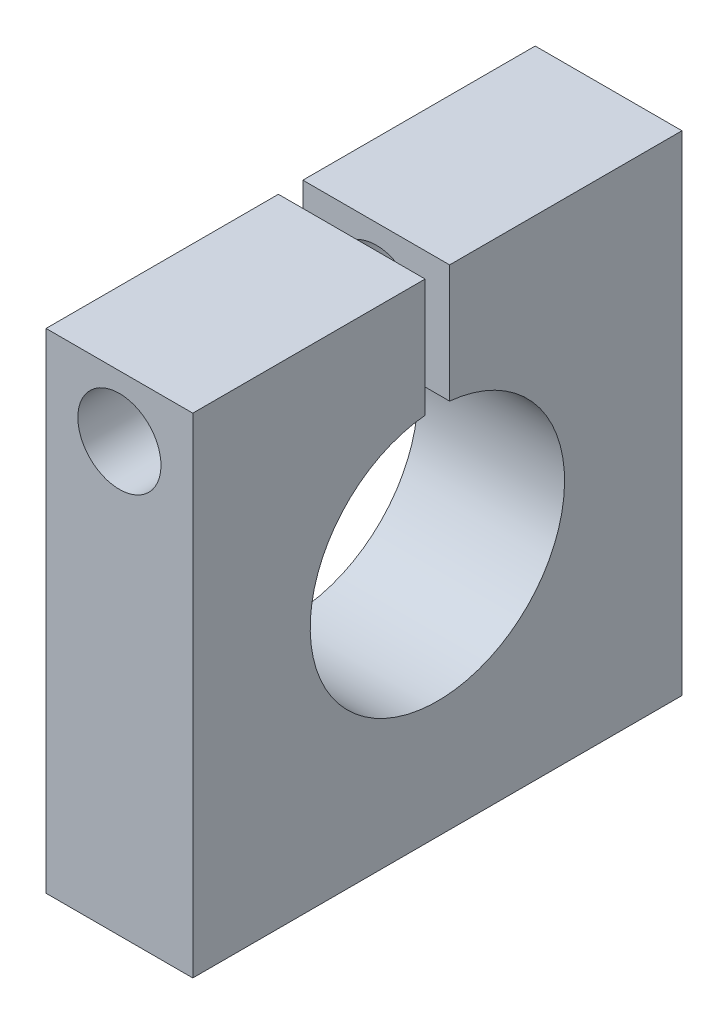
ISO-10303-21;
HEADER;
FILE_DESCRIPTION(('STEP AP214'),'2;1');
FILE_NAME('part.step','',(''),(''),'','','');
FILE_SCHEMA(('AUTOMOTIVE_DESIGN { 1 0 10303 214 1 1 1 1 }'));
ENDSEC;
DATA;
#1=APPLICATION_CONTEXT('core data for automotive mechanical design processes');
#2=APPLICATION_PROTOCOL_DEFINITION('international standard','automotive_design',2000,#1);
#3=PRODUCT_CONTEXT('',#1,'mechanical');
#4=PRODUCT('Part','Part','',(#3));
#5=PRODUCT_RELATED_PRODUCT_CATEGORY('part','',(#4));
#6=PRODUCT_DEFINITION_FORMATION('','',#4);
#7=PRODUCT_DEFINITION_CONTEXT('part definition',#1,'design');
#8=PRODUCT_DEFINITION('design','',#6,#7);
#9=PRODUCT_DEFINITION_SHAPE('','',#8);
#10=(LENGTH_UNIT() NAMED_UNIT(*) SI_UNIT(.MILLI.,.METRE.));
#11=(NAMED_UNIT(*) PLANE_ANGLE_UNIT() SI_UNIT($,.RADIAN.));
#12=(NAMED_UNIT(*) SI_UNIT($,.STERADIAN.) SOLID_ANGLE_UNIT());
#13=UNCERTAINTY_MEASURE_WITH_UNIT(LENGTH_MEASURE(1.E-05),#10,'distance_accuracy_value','');
#14=(GEOMETRIC_REPRESENTATION_CONTEXT(3) GLOBAL_UNCERTAINTY_ASSIGNED_CONTEXT((#13)) GLOBAL_UNIT_ASSIGNED_CONTEXT((#10,
#11,#12)) REPRESENTATION_CONTEXT('',''));
#15=CARTESIAN_POINT('',(0.,0.,0.));
#16=DIRECTION('',(0.,0.,1.));
#17=DIRECTION('',(1.,0.,0.));
#18=AXIS2_PLACEMENT_3D('',#15,#16,#17);
#19=CARTESIAN_POINT('',(6.,0.,0.));
#20=DIRECTION('',(-1.,0.,0.));
#21=DIRECTION('',(0.,0.,1.));
#22=AXIS2_PLACEMENT_3D('',#19,#20,#21);
#23=CYLINDRICAL_SURFACE('',#22,5.2);
#24=CARTESIAN_POINT('',(0.,0.,0.));
#25=DIRECTION('',(1.,0.,0.));
#26=DIRECTION('',(0.,0.,-1.));
#27=AXIS2_PLACEMENT_3D('',#24,#25,#26);
#28=CIRCLE('',#27,5.2);
#29=CARTESIAN_POINT('',(0.,5.17590571784301,0.499999999999998));
#30=VERTEX_POINT('',#29);
#31=CARTESIAN_POINT('',(0.,5.17590571784301,-0.500000000000003));
#32=VERTEX_POINT('',#31);
#33=EDGE_CURVE('E144',#30,#32,#28,.T.);
#34=ORIENTED_EDGE('',*,*,#33,.F.);
#35=DIRECTION('',(-1.,0.,0.));
#36=VECTOR('',#35,1.);
#37=CARTESIAN_POINT('',(6.,5.17590571784301,0.499999999999998));
#38=LINE('',#37,#36);
#39=CARTESIAN_POINT('',(6.,5.17590571784301,0.499999999999998));
#40=VERTEX_POINT('',#39);
#41=EDGE_CURVE('E11',#40,#30,#38,.T.);
#42=ORIENTED_EDGE('',*,*,#41,.F.);
#43=CARTESIAN_POINT('',(6.,0.,0.));
#44=DIRECTION('',(1.,0.,0.));
#45=DIRECTION('',(0.,0.,-1.));
#46=AXIS2_PLACEMENT_3D('',#43,#44,#45);
#47=CIRCLE('',#46,5.2);
#48=CARTESIAN_POINT('',(6.,5.17590571784301,-0.500000000000003));
#49=VERTEX_POINT('',#48);
#50=EDGE_CURVE('E135',#40,#49,#47,.T.);
#51=ORIENTED_EDGE('',*,*,#50,.T.);
#52=DIRECTION('',(-1.,0.,0.));
#53=VECTOR('',#52,1.);
#54=CARTESIAN_POINT('',(6.,5.17590571784301,-0.500000000000003));
#55=LINE('',#54,#53);
#56=EDGE_CURVE('E86',#49,#32,#55,.T.);
#57=ORIENTED_EDGE('',*,*,#56,.T.);
#58=EDGE_LOOP('',(#34,#42,#51,#57));
#59=FACE_BOUND('',#58,.T.);
#60=ADVANCED_FACE('F35',(#59),#23,.F.);
#61=CARTESIAN_POINT('',(6.,0.,0.499999999999998));
#62=DIRECTION('',(0.,0.,-1.));
#63=DIRECTION('',(0.,1.,0.));
#64=AXIS2_PLACEMENT_3D('',#61,#62,#63);
#65=PLANE('',#64);
#66=CARTESIAN_POINT('',(3.,7.5,0.499999999999999));
#67=DIRECTION('',(0.,0.,-1.));
#68=DIRECTION('',(0.,1.,0.));
#69=AXIS2_PLACEMENT_3D('',#66,#67,#68);
#70=CIRCLE('',#69,1.7);
#71=CARTESIAN_POINT('',(3.,9.2,0.499999999999999));
#72=VERTEX_POINT('',#71);
#73=EDGE_CURVE('E141',#72,#72,#70,.T.);
#74=ORIENTED_EDGE('',*,*,#73,.F.);
#75=EDGE_LOOP('',(#74));
#76=FACE_BOUND('',#75,.T.);
#77=DIRECTION('',(0.,-1.,0.));
#78=VECTOR('',#77,1.);
#79=CARTESIAN_POINT('',(0.,0.,0.499999999999998));
#80=LINE('',#79,#78);
#81=CARTESIAN_POINT('',(0.,10.,0.499999999999999));
#82=VERTEX_POINT('',#81);
#83=EDGE_CURVE('E180',#82,#30,#80,.T.);
#84=ORIENTED_EDGE('',*,*,#83,.F.);
#85=DIRECTION('',(-1.,0.,0.));
#86=VECTOR('',#85,1.);
#87=CARTESIAN_POINT('',(6.,10.,0.499999999999999));
#88=LINE('',#87,#86);
#89=CARTESIAN_POINT('',(6.,10.,0.499999999999999));
#90=VERTEX_POINT('',#89);
#91=EDGE_CURVE('E44',#90,#82,#88,.T.);
#92=ORIENTED_EDGE('',*,*,#91,.F.);
#93=DIRECTION('',(0.,-1.,0.));
#94=VECTOR('',#93,1.);
#95=CARTESIAN_POINT('',(6.,0.,0.499999999999998));
#96=LINE('',#95,#94);
#97=EDGE_CURVE('E131',#90,#40,#96,.T.);
#98=ORIENTED_EDGE('',*,*,#97,.T.);
#99=ORIENTED_EDGE('',*,*,#41,.T.);
#100=EDGE_LOOP('',(#84,#92,#98,#99));
#101=FACE_BOUND('',#100,.T.);
#102=ADVANCED_FACE('F172',(#76,#101),#65,.T.);
#103=CARTESIAN_POINT('',(6.,10.,0.));
#104=DIRECTION('',(0.,1.,0.));
#105=DIRECTION('',(0.,0.,1.));
#106=AXIS2_PLACEMENT_3D('',#103,#104,#105);
#107=PLANE('',#106);
#108=DIRECTION('',(0.,0.,-1.));
#109=VECTOR('',#108,1.);
#110=CARTESIAN_POINT('',(0.,10.,0.));
#111=LINE('',#110,#109);
#112=CARTESIAN_POINT('',(0.,10.,10.));
#113=VERTEX_POINT('',#112);
#114=EDGE_CURVE('E186',#113,#82,#111,.T.);
#115=ORIENTED_EDGE('',*,*,#114,.F.);
#116=DIRECTION('',(-1.,0.,0.));
#117=VECTOR('',#116,1.);
#118=CARTESIAN_POINT('',(6.,10.,10.));
#119=LINE('',#118,#117);
#120=CARTESIAN_POINT('',(6.,10.,10.));
#121=VERTEX_POINT('',#120);
#122=EDGE_CURVE('E204',#121,#113,#119,.T.);
#123=ORIENTED_EDGE('',*,*,#122,.F.);
#124=DIRECTION('',(0.,0.,-1.));
#125=VECTOR('',#124,1.);
#126=CARTESIAN_POINT('',(6.,10.,0.));
#127=LINE('',#126,#125);
#128=EDGE_CURVE('E125',#121,#90,#127,.T.);
#129=ORIENTED_EDGE('',*,*,#128,.T.);
#130=ORIENTED_EDGE('',*,*,#91,.T.);
#131=EDGE_LOOP('',(#115,#123,#129,#130));
#132=FACE_BOUND('',#131,.T.);
#133=ADVANCED_FACE('F176',(#132),#107,.T.);
#134=CARTESIAN_POINT('',(6.,0.,10.));
#135=DIRECTION('',(0.,0.,-1.));
#136=DIRECTION('',(-1.,0.,0.));
#137=AXIS2_PLACEMENT_3D('',#134,#135,#136);
#138=PLANE('',#137);
#139=CARTESIAN_POINT('',(3.,7.5,10.));
#140=DIRECTION('',(0.,0.,-1.));
#141=DIRECTION('',(0.,1.,0.));
#142=AXIS2_PLACEMENT_3D('',#139,#140,#141);
#143=CIRCLE('',#142,1.7);
#144=CARTESIAN_POINT('',(3.,9.2,10.));
#145=VERTEX_POINT('',#144);
#146=EDGE_CURVE('E148',#145,#145,#143,.T.);
#147=ORIENTED_EDGE('',*,*,#146,.T.);
#148=EDGE_LOOP('',(#147));
#149=FACE_BOUND('',#148,.T.);
#150=DIRECTION('',(0.,-1.,0.));
#151=VECTOR('',#150,1.);
#152=CARTESIAN_POINT('',(0.,0.,10.));
#153=LINE('',#152,#151);
#154=CARTESIAN_POINT('',(0.,-10.,10.));
#155=VERTEX_POINT('',#154);
#156=EDGE_CURVE('E188',#113,#155,#153,.T.);
#157=ORIENTED_EDGE('',*,*,#156,.T.);
#158=DIRECTION('',(-1.,0.,0.));
#159=VECTOR('',#158,1.);
#160=CARTESIAN_POINT('',(6.,-10.,10.));
#161=LINE('',#160,#159);
#162=CARTESIAN_POINT('',(6.,-10.,10.));
#163=VERTEX_POINT('',#162);
#164=EDGE_CURVE('E201',#163,#155,#161,.T.);
#165=ORIENTED_EDGE('',*,*,#164,.F.);
#166=DIRECTION('',(0.,-1.,0.));
#167=VECTOR('',#166,1.);
#168=CARTESIAN_POINT('',(6.,0.,10.));
#169=LINE('',#168,#167);
#170=EDGE_CURVE('E130',#121,#163,#169,.T.);
#171=ORIENTED_EDGE('',*,*,#170,.F.);
#172=ORIENTED_EDGE('',*,*,#122,.T.);
#173=EDGE_LOOP('',(#157,#165,#171,#172));
#174=FACE_BOUND('',#173,.T.);
#175=ADVANCED_FACE('F209',(#149,#174),#138,.F.);
#176=CARTESIAN_POINT('',(6.,-10.,0.));
#177=DIRECTION('',(0.,1.,0.));
#178=DIRECTION('',(0.,0.,1.));
#179=AXIS2_PLACEMENT_3D('',#176,#177,#178);
#180=PLANE('',#179);
#181=DIRECTION('',(0.,0.,-1.));
#182=VECTOR('',#181,1.);
#183=CARTESIAN_POINT('',(0.,-10.,0.));
#184=LINE('',#183,#182);
#185=CARTESIAN_POINT('',(0.,-10.,-10.));
#186=VERTEX_POINT('',#185);
#187=EDGE_CURVE('E193',#155,#186,#184,.T.);
#188=ORIENTED_EDGE('',*,*,#187,.T.);
#189=DIRECTION('',(-1.,0.,0.));
#190=VECTOR('',#189,1.);
#191=CARTESIAN_POINT('',(6.,-10.,-10.));
#192=LINE('',#191,#190);
#193=CARTESIAN_POINT('',(6.,-10.,-10.));
#194=VERTEX_POINT('',#193);
#195=EDGE_CURVE('E115',#194,#186,#192,.T.);
#196=ORIENTED_EDGE('',*,*,#195,.F.);
#197=DIRECTION('',(0.,0.,-1.));
#198=VECTOR('',#197,1.);
#199=CARTESIAN_POINT('',(6.,-10.,0.));
#200=LINE('',#199,#198);
#201=EDGE_CURVE('E120',#163,#194,#200,.T.);
#202=ORIENTED_EDGE('',*,*,#201,.F.);
#203=ORIENTED_EDGE('',*,*,#164,.T.);
#204=EDGE_LOOP('',(#188,#196,#202,#203));
#205=FACE_BOUND('',#204,.T.);
#206=ADVANCED_FACE('F212',(#205),#180,.F.);
#207=CARTESIAN_POINT('',(6.,0.,-10.));
#208=DIRECTION('',(0.,0.,-1.));
#209=DIRECTION('',(0.,1.,0.));
#210=AXIS2_PLACEMENT_3D('',#207,#208,#209);
#211=PLANE('',#210);
#212=CARTESIAN_POINT('',(3.,7.5,-10.));
#213=DIRECTION('',(0.,0.,-1.));
#214=DIRECTION('',(0.,1.,0.));
#215=AXIS2_PLACEMENT_3D('',#212,#213,#214);
#216=CIRCLE('',#215,1.7);
#217=CARTESIAN_POINT('',(3.,9.2,-10.));
#218=VERTEX_POINT('',#217);
#219=EDGE_CURVE('E145',#218,#218,#216,.T.);
#220=ORIENTED_EDGE('',*,*,#219,.F.);
#221=EDGE_LOOP('',(#220));
#222=FACE_BOUND('',#221,.T.);
#223=DIRECTION('',(0.,-1.,0.));
#224=VECTOR('',#223,1.);
#225=CARTESIAN_POINT('',(0.,0.,-10.));
#226=LINE('',#225,#224);
#227=CARTESIAN_POINT('',(0.,10.,-10.));
#228=VERTEX_POINT('',#227);
#229=EDGE_CURVE('E110',#228,#186,#226,.T.);
#230=ORIENTED_EDGE('',*,*,#229,.F.);
#231=DIRECTION('',(-1.,0.,0.));
#232=VECTOR('',#231,1.);
#233=CARTESIAN_POINT('',(6.,10.,-10.));
#234=LINE('',#233,#232);
#235=CARTESIAN_POINT('',(6.,10.,-10.));
#236=VERTEX_POINT('',#235);
#237=EDGE_CURVE('E105',#236,#228,#234,.T.);
#238=ORIENTED_EDGE('',*,*,#237,.F.);
#239=DIRECTION('',(0.,-1.,0.));
#240=VECTOR('',#239,1.);
#241=CARTESIAN_POINT('',(6.,0.,-10.));
#242=LINE('',#241,#240);
#243=EDGE_CURVE('E108',#236,#194,#242,.T.);
#244=ORIENTED_EDGE('',*,*,#243,.T.);
#245=ORIENTED_EDGE('',*,*,#195,.T.);
#246=EDGE_LOOP('',(#230,#238,#244,#245));
#247=FACE_BOUND('',#246,.T.);
#248=ADVANCED_FACE('F107',(#222,#247),#211,.T.);
#249=CARTESIAN_POINT('',(0.,10.,-0.500000000000002));
#250=VERTEX_POINT('',#249);
#251=EDGE_CURVE('E190',#250,#228,#111,.T.);
#252=ORIENTED_EDGE('',*,*,#251,.F.);
#253=DIRECTION('',(-1.,0.,0.));
#254=VECTOR('',#253,1.);
#255=CARTESIAN_POINT('',(6.,10.,-0.500000000000002));
#256=LINE('',#255,#254);
#257=CARTESIAN_POINT('',(6.,10.,-0.500000000000002));
#258=VERTEX_POINT('',#257);
#259=EDGE_CURVE('E79',#258,#250,#256,.T.);
#260=ORIENTED_EDGE('',*,*,#259,.F.);
#261=EDGE_CURVE('E118',#258,#236,#127,.T.);
#262=ORIENTED_EDGE('',*,*,#261,.T.);
#263=ORIENTED_EDGE('',*,*,#237,.T.);
#264=EDGE_LOOP('',(#252,#260,#262,#263));
#265=FACE_BOUND('',#264,.T.);
#266=ADVANCED_FACE('F123',(#265),#107,.T.);
#267=CARTESIAN_POINT('',(6.,0.,-0.500000000000003));
#268=DIRECTION('',(0.,0.,-1.));
#269=DIRECTION('',(0.,1.,0.));
#270=AXIS2_PLACEMENT_3D('',#267,#268,#269);
#271=PLANE('',#270);
#272=CARTESIAN_POINT('',(3.,7.5,-0.500000000000002));
#273=DIRECTION('',(0.,0.,-1.));
#274=DIRECTION('',(0.,1.,0.));
#275=AXIS2_PLACEMENT_3D('',#272,#273,#274);
#276=CIRCLE('',#275,1.7);
#277=CARTESIAN_POINT('',(3.,9.2,-0.500000000000002));
#278=VERTEX_POINT('',#277);
#279=EDGE_CURVE('E38',#278,#278,#276,.T.);
#280=ORIENTED_EDGE('',*,*,#279,.T.);
#281=EDGE_LOOP('',(#280));
#282=FACE_BOUND('',#281,.T.);
#283=DIRECTION('',(0.,-1.,0.));
#284=VECTOR('',#283,1.);
#285=CARTESIAN_POINT('',(0.,0.,-0.500000000000003));
#286=LINE('',#285,#284);
#287=EDGE_CURVE('E138',#250,#32,#286,.T.);
#288=ORIENTED_EDGE('',*,*,#287,.T.);
#289=ORIENTED_EDGE('',*,*,#56,.F.);
#290=DIRECTION('',(0.,-1.,0.));
#291=VECTOR('',#290,1.);
#292=CARTESIAN_POINT('',(6.,0.,-0.500000000000003));
#293=LINE('',#292,#291);
#294=EDGE_CURVE('E52',#258,#49,#293,.T.);
#295=ORIENTED_EDGE('',*,*,#294,.F.);
#296=ORIENTED_EDGE('',*,*,#259,.T.);
#297=EDGE_LOOP('',(#288,#289,#295,#296));
#298=FACE_BOUND('',#297,.T.);
#299=ADVANCED_FACE('F155',(#282,#298),#271,.F.);
#300=CARTESIAN_POINT('',(6.,0.,0.));
#301=DIRECTION('',(1.,0.,0.));
#302=DIRECTION('',(0.,0.,-1.));
#303=AXIS2_PLACEMENT_3D('',#300,#301,#302);
#304=PLANE('',#303);
#305=ORIENTED_EDGE('',*,*,#50,.F.);
#306=ORIENTED_EDGE('',*,*,#97,.F.);
#307=ORIENTED_EDGE('',*,*,#128,.F.);
#308=ORIENTED_EDGE('',*,*,#170,.T.);
#309=ORIENTED_EDGE('',*,*,#201,.T.);
#310=ORIENTED_EDGE('',*,*,#243,.F.);
#311=ORIENTED_EDGE('',*,*,#261,.F.);
#312=ORIENTED_EDGE('',*,*,#294,.T.);
#313=EDGE_LOOP('',(#305,#306,#307,#308,#309,#310,#311,#312));
#314=FACE_BOUND('',#313,.T.);
#315=ADVANCED_FACE('F117',(#314),#304,.T.);
#316=CARTESIAN_POINT('',(0.,0.,0.));
#317=DIRECTION('',(1.,0.,0.));
#318=DIRECTION('',(0.,0.,-1.));
#319=AXIS2_PLACEMENT_3D('',#316,#317,#318);
#320=PLANE('',#319);
#321=ORIENTED_EDGE('',*,*,#33,.T.);
#322=ORIENTED_EDGE('',*,*,#287,.F.);
#323=ORIENTED_EDGE('',*,*,#251,.T.);
#324=ORIENTED_EDGE('',*,*,#229,.T.);
#325=ORIENTED_EDGE('',*,*,#187,.F.);
#326=ORIENTED_EDGE('',*,*,#156,.F.);
#327=ORIENTED_EDGE('',*,*,#114,.T.);
#328=ORIENTED_EDGE('',*,*,#83,.T.);
#329=EDGE_LOOP('',(#321,#322,#323,#324,#325,#326,#327,#328));
#330=FACE_BOUND('',#329,.T.);
#331=ADVANCED_FACE('F160',(#330),#320,.F.);
#332=CARTESIAN_POINT('',(3.,7.5,10.));
#333=DIRECTION('',(0.,0.,-1.));
#334=DIRECTION('',(0.,1.,0.));
#335=AXIS2_PLACEMENT_3D('',#332,#333,#334);
#336=CYLINDRICAL_SURFACE('',#335,1.7);
#337=ORIENTED_EDGE('',*,*,#219,.T.);
#338=EDGE_LOOP('',(#337));
#339=FACE_BOUND('',#338,.T.);
#340=ORIENTED_EDGE('',*,*,#279,.F.);
#341=EDGE_LOOP('',(#340));
#342=FACE_BOUND('',#341,.T.);
#343=ADVANCED_FACE('F157',(#339,#342),#336,.F.);
#344=ORIENTED_EDGE('',*,*,#73,.T.);
#345=EDGE_LOOP('',(#344));
#346=FACE_BOUND('',#345,.T.);
#347=ORIENTED_EDGE('',*,*,#146,.F.);
#348=EDGE_LOOP('',(#347));
#349=FACE_BOUND('',#348,.T.);
#350=ADVANCED_FACE('F159',(#346,#349),#336,.F.);
#351=CLOSED_SHELL('',(#60,#102,#133,#175,#206,#248,#266,#299,#315,#331,#343,#350));
#352=MANIFOLD_SOLID_BREP('B2',#351);
#353=ADVANCED_BREP_SHAPE_REPRESENTATION('',(#18,#352),#14);
#354=SHAPE_DEFINITION_REPRESENTATION(#9,#353);
ENDSEC;
END-ISO-10303-21;
